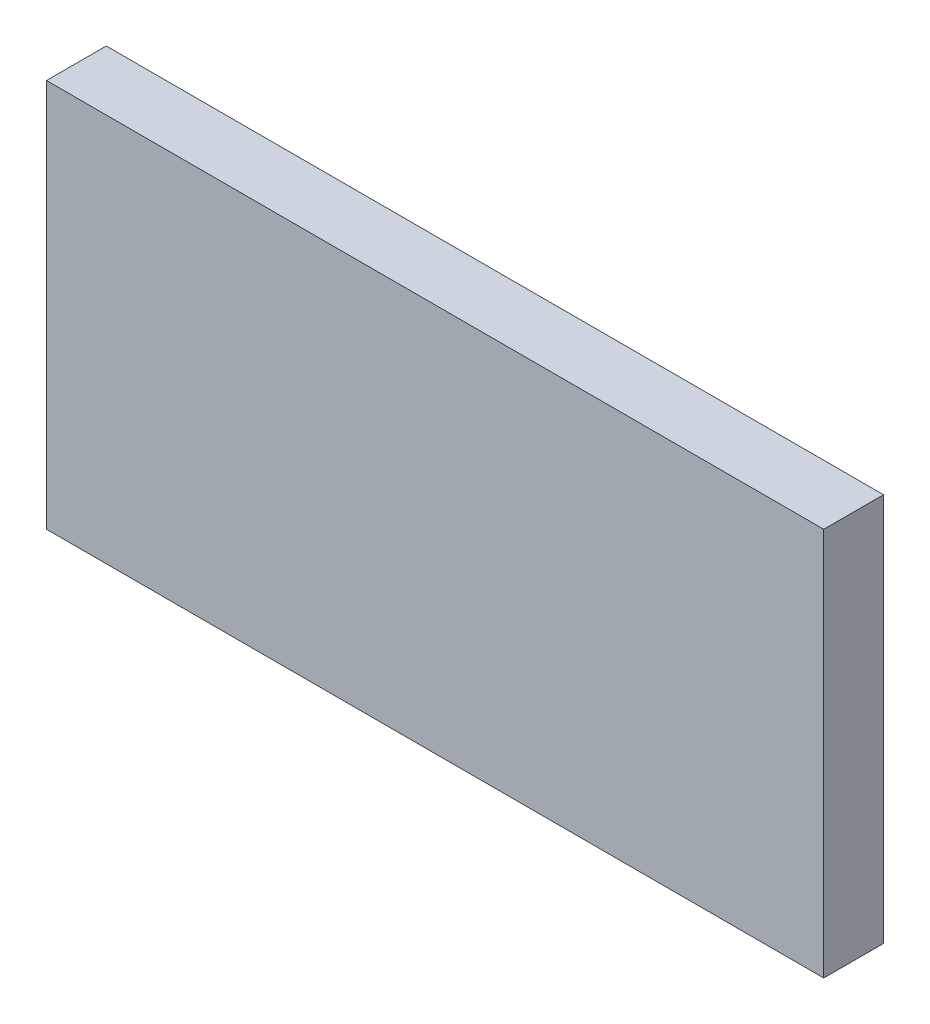
ISO-10303-21;
HEADER;
FILE_DESCRIPTION(('STEP AP214'),'2;1');
FILE_NAME('part.step','',(''),(''),'','','');
FILE_SCHEMA(('AUTOMOTIVE_DESIGN { 1 0 10303 214 1 1 1 1 }'));
ENDSEC;
DATA;
#1=APPLICATION_CONTEXT('core data for automotive mechanical design processes');
#2=APPLICATION_PROTOCOL_DEFINITION('international standard','automotive_design',2000,#1);
#3=PRODUCT_CONTEXT('',#1,'mechanical');
#4=PRODUCT('Part','Part','',(#3));
#5=PRODUCT_RELATED_PRODUCT_CATEGORY('part','',(#4));
#6=PRODUCT_DEFINITION_FORMATION('','',#4);
#7=PRODUCT_DEFINITION_CONTEXT('part definition',#1,'design');
#8=PRODUCT_DEFINITION('design','',#6,#7);
#9=PRODUCT_DEFINITION_SHAPE('','',#8);
#10=(LENGTH_UNIT() NAMED_UNIT(*) SI_UNIT(.MILLI.,.METRE.));
#11=(NAMED_UNIT(*) PLANE_ANGLE_UNIT() SI_UNIT($,.RADIAN.));
#12=(NAMED_UNIT(*) SI_UNIT($,.STERADIAN.) SOLID_ANGLE_UNIT());
#13=UNCERTAINTY_MEASURE_WITH_UNIT(LENGTH_MEASURE(1.E-05),#10,'distance_accuracy_value','');
#14=(GEOMETRIC_REPRESENTATION_CONTEXT(3) GLOBAL_UNCERTAINTY_ASSIGNED_CONTEXT((#13)) GLOBAL_UNIT_ASSIGNED_CONTEXT((#10,
#11,#12)) REPRESENTATION_CONTEXT('',''));
#15=CARTESIAN_POINT('',(0.,0.,0.));
#16=DIRECTION('',(0.,0.,1.));
#17=DIRECTION('',(1.,0.,0.));
#18=AXIS2_PLACEMENT_3D('',#15,#16,#17);
#19=CARTESIAN_POINT('',(-12.9999994,6.4999997,2.00000108));
#20=DIRECTION('',(0.,0.,1.));
#21=DIRECTION('',(1.,0.,0.));
#22=AXIS2_PLACEMENT_3D('',#19,#20,#21);
#23=PLANE('',#22);
#24=DIRECTION('',(0.,1.,0.));
#25=VECTOR('',#24,1.);
#26=CARTESIAN_POINT('',(13.00000194,6.4999997,2.00000108));
#27=LINE('',#26,#25);
#28=CARTESIAN_POINT('',(13.00000194,6.4999997,2.00000108));
#29=VERTEX_POINT('',#28);
#30=CARTESIAN_POINT('',(13.00000194,-6.4999997,2.00000108));
#31=VERTEX_POINT('',#30);
#32=EDGE_CURVE('E53',#29,#31,#27,.F.);
#33=ORIENTED_EDGE('',*,*,#32,.F.);
#34=DIRECTION('',(-1.,0.,0.));
#35=VECTOR('',#34,1.);
#36=CARTESIAN_POINT('',(-12.9999994,6.4999997,2.00000108));
#37=LINE('',#36,#35);
#38=CARTESIAN_POINT('',(-12.9999994,6.4999997,2.00000108));
#39=VERTEX_POINT('',#38);
#40=EDGE_CURVE('E68',#39,#29,#37,.F.);
#41=ORIENTED_EDGE('',*,*,#40,.F.);
#42=DIRECTION('',(0.,1.,0.));
#43=VECTOR('',#42,1.);
#44=CARTESIAN_POINT('',(-12.9999994,-6.4999997,2.00000108));
#45=LINE('',#44,#43);
#46=CARTESIAN_POINT('',(-12.9999994,-6.4999997,2.00000108));
#47=VERTEX_POINT('',#46);
#48=EDGE_CURVE('E20',#47,#39,#45,.T.);
#49=ORIENTED_EDGE('',*,*,#48,.F.);
#50=DIRECTION('',(1.,0.,0.));
#51=VECTOR('',#50,1.);
#52=CARTESIAN_POINT('',(13.00000194,-6.4999997,2.00000108));
#53=LINE('',#52,#51);
#54=EDGE_CURVE('E58',#31,#47,#53,.F.);
#55=ORIENTED_EDGE('',*,*,#54,.F.);
#56=EDGE_LOOP('',(#33,#41,#49,#55));
#57=FACE_BOUND('',#56,.T.);
#58=ADVANCED_FACE('F17',(#57),#23,.T.);
#59=CARTESIAN_POINT('',(-12.9999994,-6.4999997,0.));
#60=DIRECTION('',(-1.,0.,0.));
#61=DIRECTION('',(0.,0.,1.));
#62=AXIS2_PLACEMENT_3D('',#59,#60,#61);
#63=PLANE('',#62);
#64=DIRECTION('',(0.,0.,1.));
#65=VECTOR('',#64,1.);
#66=CARTESIAN_POINT('',(-12.9999994,6.4999997,0.));
#67=LINE('',#66,#65);
#68=CARTESIAN_POINT('',(-12.9999994,6.4999997,0.));
#69=VERTEX_POINT('',#68);
#70=EDGE_CURVE('E79',#69,#39,#67,.T.);
#71=ORIENTED_EDGE('',*,*,#70,.F.);
#72=DIRECTION('',(0.,1.,0.));
#73=VECTOR('',#72,1.);
#74=CARTESIAN_POINT('',(-12.9999994,6.4999997,0.));
#75=LINE('',#74,#73);
#76=CARTESIAN_POINT('',(-12.9999994,-6.4999997,0.));
#77=VERTEX_POINT('',#76);
#78=EDGE_CURVE('E74',#69,#77,#75,.F.);
#79=ORIENTED_EDGE('',*,*,#78,.T.);
#80=DIRECTION('',(0.,0.,1.));
#81=VECTOR('',#80,1.);
#82=CARTESIAN_POINT('',(-12.9999994,-6.49999969999999,0.));
#83=LINE('',#82,#81);
#84=EDGE_CURVE('E63',#47,#77,#83,.F.);
#85=ORIENTED_EDGE('',*,*,#84,.F.);
#86=ORIENTED_EDGE('',*,*,#48,.T.);
#87=EDGE_LOOP('',(#71,#79,#85,#86));
#88=FACE_BOUND('',#87,.T.);
#89=ADVANCED_FACE('F73',(#88),#63,.T.);
#90=CARTESIAN_POINT('',(13.00000194,-6.4999997,0.));
#91=DIRECTION('',(0.,-1.,0.));
#92=DIRECTION('',(1.,0.,0.));
#93=AXIS2_PLACEMENT_3D('',#90,#91,#92);
#94=PLANE('',#93);
#95=ORIENTED_EDGE('',*,*,#84,.T.);
#96=DIRECTION('',(1.,0.,0.));
#97=VECTOR('',#96,1.);
#98=CARTESIAN_POINT('',(-12.9999994,-6.4999997,0.));
#99=LINE('',#98,#97);
#100=CARTESIAN_POINT('',(13.00000194,-6.4999997,0.));
#101=VERTEX_POINT('',#100);
#102=EDGE_CURVE('E84',#77,#101,#99,.T.);
#103=ORIENTED_EDGE('',*,*,#102,.T.);
#104=DIRECTION('',(0.,0.,-1.));
#105=VECTOR('',#104,1.);
#106=CARTESIAN_POINT('',(13.00000194,-6.4999997,0.));
#107=LINE('',#106,#105);
#108=EDGE_CURVE('E65',#31,#101,#107,.T.);
#109=ORIENTED_EDGE('',*,*,#108,.F.);
#110=ORIENTED_EDGE('',*,*,#54,.T.);
#111=EDGE_LOOP('',(#95,#103,#109,#110));
#112=FACE_BOUND('',#111,.T.);
#113=ADVANCED_FACE('F60',(#112),#94,.T.);
#114=CARTESIAN_POINT('',(13.00000194,6.4999997,0.));
#115=DIRECTION('',(1.,0.,0.));
#116=DIRECTION('',(0.,0.,-1.));
#117=AXIS2_PLACEMENT_3D('',#114,#115,#116);
#118=PLANE('',#117);
#119=ORIENTED_EDGE('',*,*,#108,.T.);
#120=DIRECTION('',(0.,1.,0.));
#121=VECTOR('',#120,1.);
#122=CARTESIAN_POINT('',(13.00000194,6.4999997,0.));
#123=LINE('',#122,#121);
#124=CARTESIAN_POINT('',(13.00000194,6.4999997,0.));
#125=VERTEX_POINT('',#124);
#126=EDGE_CURVE('E26',#101,#125,#123,.T.);
#127=ORIENTED_EDGE('',*,*,#126,.T.);
#128=DIRECTION('',(0.,0.,1.));
#129=VECTOR('',#128,1.);
#130=CARTESIAN_POINT('',(13.00000194,6.49999969999999,0.));
#131=LINE('',#130,#129);
#132=EDGE_CURVE('E34',#29,#125,#131,.F.);
#133=ORIENTED_EDGE('',*,*,#132,.F.);
#134=ORIENTED_EDGE('',*,*,#32,.T.);
#135=EDGE_LOOP('',(#119,#127,#133,#134));
#136=FACE_BOUND('',#135,.T.);
#137=ADVANCED_FACE('F88',(#136),#118,.T.);
#138=CARTESIAN_POINT('',(-12.9999994,6.4999997,0.));
#139=DIRECTION('',(0.,1.,0.));
#140=DIRECTION('',(-1.,0.,0.));
#141=AXIS2_PLACEMENT_3D('',#138,#139,#140);
#142=PLANE('',#141);
#143=ORIENTED_EDGE('',*,*,#132,.T.);
#144=DIRECTION('',(1.,0.,0.));
#145=VECTOR('',#144,1.);
#146=CARTESIAN_POINT('',(-12.9999994,6.4999997,0.));
#147=LINE('',#146,#145);
#148=EDGE_CURVE('E11',#125,#69,#147,.F.);
#149=ORIENTED_EDGE('',*,*,#148,.T.);
#150=ORIENTED_EDGE('',*,*,#70,.T.);
#151=ORIENTED_EDGE('',*,*,#40,.T.);
#152=EDGE_LOOP('',(#143,#149,#150,#151));
#153=FACE_BOUND('',#152,.T.);
#154=ADVANCED_FACE('F91',(#153),#142,.T.);
#155=CARTESIAN_POINT('',(-12.9999994,6.4999997,0.));
#156=DIRECTION('',(0.,0.,1.));
#157=DIRECTION('',(1.,0.,0.));
#158=AXIS2_PLACEMENT_3D('',#155,#156,#157);
#159=PLANE('',#158);
#160=ORIENTED_EDGE('',*,*,#126,.F.);
#161=ORIENTED_EDGE('',*,*,#102,.F.);
#162=ORIENTED_EDGE('',*,*,#78,.F.);
#163=ORIENTED_EDGE('',*,*,#148,.F.);
#164=EDGE_LOOP('',(#160,#161,#162,#163));
#165=FACE_BOUND('',#164,.T.);
#166=ADVANCED_FACE('F90',(#165),#159,.F.);
#167=CLOSED_SHELL('',(#58,#89,#113,#137,#154,#166));
#168=MANIFOLD_SOLID_BREP('B1',#167);
#169=ADVANCED_BREP_SHAPE_REPRESENTATION('',(#18,#168),#14);
#170=SHAPE_DEFINITION_REPRESENTATION(#9,#169);
ENDSEC;
END-ISO-10303-21;
